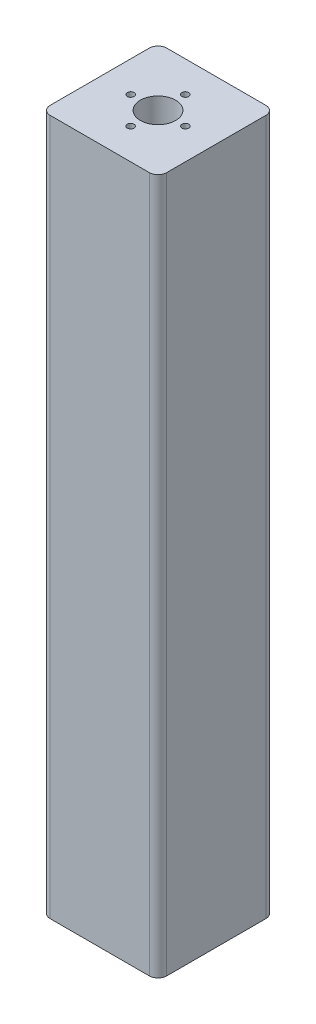
ISO-10303-21;
HEADER;
FILE_DESCRIPTION(('STEP AP214'),'2;1');
FILE_NAME('part.step','',(''),(''),'','','');
FILE_SCHEMA(('AUTOMOTIVE_DESIGN { 1 0 10303 214 1 1 1 1 }'));
ENDSEC;
DATA;
#1=APPLICATION_CONTEXT('core data for automotive mechanical design processes');
#2=APPLICATION_PROTOCOL_DEFINITION('international standard','automotive_design',2000,#1);
#3=PRODUCT_CONTEXT('',#1,'mechanical');
#4=PRODUCT('Part','Part','',(#3));
#5=PRODUCT_RELATED_PRODUCT_CATEGORY('part','',(#4));
#6=PRODUCT_DEFINITION_FORMATION('','',#4);
#7=PRODUCT_DEFINITION_CONTEXT('part definition',#1,'design');
#8=PRODUCT_DEFINITION('design','',#6,#7);
#9=PRODUCT_DEFINITION_SHAPE('','',#8);
#10=(LENGTH_UNIT() NAMED_UNIT(*) SI_UNIT(.MILLI.,.METRE.));
#11=(NAMED_UNIT(*) PLANE_ANGLE_UNIT() SI_UNIT($,.RADIAN.));
#12=(NAMED_UNIT(*) SI_UNIT($,.STERADIAN.) SOLID_ANGLE_UNIT());
#13=UNCERTAINTY_MEASURE_WITH_UNIT(LENGTH_MEASURE(1.E-05),#10,'distance_accuracy_value','');
#14=(GEOMETRIC_REPRESENTATION_CONTEXT(3) GLOBAL_UNCERTAINTY_ASSIGNED_CONTEXT((#13)) GLOBAL_UNIT_ASSIGNED_CONTEXT((#10,
#11,#12)) REPRESENTATION_CONTEXT('',''));
#15=CARTESIAN_POINT('',(0.,0.,0.));
#16=DIRECTION('',(0.,0.,1.));
#17=DIRECTION('',(1.,0.,0.));
#18=AXIS2_PLACEMENT_3D('',#15,#16,#17);
#19=CARTESIAN_POINT('',(-17.018,203.2,-17.018));
#20=DIRECTION('',(1.,0.,0.));
#21=DIRECTION('',(0.,0.,-1.));
#22=AXIS2_PLACEMENT_3D('',#19,#20,#21);
#23=PLANE('',#22);
#24=DIRECTION('',(0.,0.,1.));
#25=VECTOR('',#24,1.);
#26=CARTESIAN_POINT('',(-17.018,203.2,-17.018));
#27=LINE('',#26,#25);
#28=CARTESIAN_POINT('',(-17.018,203.2,-14.478));
#29=VERTEX_POINT('',#28);
#30=CARTESIAN_POINT('',(-17.018,203.2,14.478));
#31=VERTEX_POINT('',#30);
#32=EDGE_CURVE('E126',#29,#31,#27,.T.);
#33=ORIENTED_EDGE('',*,*,#32,.F.);
#34=DIRECTION('',(0.,-1.,0.));
#35=VECTOR('',#34,1.);
#36=CARTESIAN_POINT('',(-17.018,203.2,-14.478));
#37=LINE('',#36,#35);
#38=CARTESIAN_POINT('',(-17.018,0.,-14.478));
#39=VERTEX_POINT('',#38);
#40=EDGE_CURVE('E152',#29,#39,#37,.T.);
#41=ORIENTED_EDGE('',*,*,#40,.T.);
#42=DIRECTION('',(0.,0.,1.));
#43=VECTOR('',#42,1.);
#44=CARTESIAN_POINT('',(-17.018,0.,-17.018));
#45=LINE('',#44,#43);
#46=CARTESIAN_POINT('',(-17.018,0.,14.478));
#47=VERTEX_POINT('',#46);
#48=EDGE_CURVE('E161',#39,#47,#45,.T.);
#49=ORIENTED_EDGE('',*,*,#48,.T.);
#50=DIRECTION('',(0.,-1.,0.));
#51=VECTOR('',#50,1.);
#52=CARTESIAN_POINT('',(-17.018,203.2,14.478));
#53=LINE('',#52,#51);
#54=EDGE_CURVE('E150',#47,#31,#53,.F.);
#55=ORIENTED_EDGE('',*,*,#54,.T.);
#56=EDGE_LOOP('',(#33,#41,#49,#55));
#57=FACE_BOUND('',#56,.T.);
#58=ADVANCED_FACE('F34',(#57),#23,.F.);
#59=CARTESIAN_POINT('',(17.018,203.2,17.018));
#60=DIRECTION('',(0.,0.,-1.));
#61=DIRECTION('',(-1.,0.,0.));
#62=AXIS2_PLACEMENT_3D('',#59,#60,#61);
#63=PLANE('',#62);
#64=DIRECTION('',(1.,0.,0.));
#65=VECTOR('',#64,1.);
#66=CARTESIAN_POINT('',(17.018,0.,17.018));
#67=LINE('',#66,#65);
#68=CARTESIAN_POINT('',(-14.478,0.,17.018));
#69=VERTEX_POINT('',#68);
#70=CARTESIAN_POINT('',(14.478,0.,17.018));
#71=VERTEX_POINT('',#70);
#72=EDGE_CURVE('E131',#69,#71,#67,.T.);
#73=ORIENTED_EDGE('',*,*,#72,.T.);
#74=DIRECTION('',(0.,-1.,0.));
#75=VECTOR('',#74,1.);
#76=CARTESIAN_POINT('',(14.478,203.2,17.018));
#77=LINE('',#76,#75);
#78=CARTESIAN_POINT('',(14.478,203.2,17.018));
#79=VERTEX_POINT('',#78);
#80=EDGE_CURVE('E11',#71,#79,#77,.F.);
#81=ORIENTED_EDGE('',*,*,#80,.T.);
#82=DIRECTION('',(1.,0.,0.));
#83=VECTOR('',#82,1.);
#84=CARTESIAN_POINT('',(17.018,203.2,17.018));
#85=LINE('',#84,#83);
#86=CARTESIAN_POINT('',(-14.478,203.2,17.018));
#87=VERTEX_POINT('',#86);
#88=EDGE_CURVE('E129',#87,#79,#85,.T.);
#89=ORIENTED_EDGE('',*,*,#88,.F.);
#90=DIRECTION('',(0.,-1.,0.));
#91=VECTOR('',#90,1.);
#92=CARTESIAN_POINT('',(-14.478,203.2,17.018));
#93=LINE('',#92,#91);
#94=EDGE_CURVE('E43',#87,#69,#93,.T.);
#95=ORIENTED_EDGE('',*,*,#94,.T.);
#96=EDGE_LOOP('',(#73,#81,#89,#95));
#97=FACE_BOUND('',#96,.T.);
#98=ADVANCED_FACE('F158',(#97),#63,.F.);
#99=CARTESIAN_POINT('',(17.018,203.2,-17.018));
#100=DIRECTION('',(-1.,0.,0.));
#101=DIRECTION('',(0.,0.,1.));
#102=AXIS2_PLACEMENT_3D('',#99,#100,#101);
#103=PLANE('',#102);
#104=DIRECTION('',(0.,0.,-1.));
#105=VECTOR('',#104,1.);
#106=CARTESIAN_POINT('',(17.018,0.,-17.018));
#107=LINE('',#106,#105);
#108=CARTESIAN_POINT('',(17.018,0.,14.478));
#109=VERTEX_POINT('',#108);
#110=CARTESIAN_POINT('',(17.018,0.,-14.478));
#111=VERTEX_POINT('',#110);
#112=EDGE_CURVE('E127',#109,#111,#107,.T.);
#113=ORIENTED_EDGE('',*,*,#112,.T.);
#114=DIRECTION('',(0.,-1.,0.));
#115=VECTOR('',#114,1.);
#116=CARTESIAN_POINT('',(17.018,203.2,-14.478));
#117=LINE('',#116,#115);
#118=CARTESIAN_POINT('',(17.018,203.2,-14.478));
#119=VERTEX_POINT('',#118);
#120=EDGE_CURVE('E105',#111,#119,#117,.F.);
#121=ORIENTED_EDGE('',*,*,#120,.T.);
#122=DIRECTION('',(0.,0.,-1.));
#123=VECTOR('',#122,1.);
#124=CARTESIAN_POINT('',(17.018,203.2,-17.018));
#125=LINE('',#124,#123);
#126=CARTESIAN_POINT('',(17.018,203.2,14.478));
#127=VERTEX_POINT('',#126);
#128=EDGE_CURVE('E166',#127,#119,#125,.T.);
#129=ORIENTED_EDGE('',*,*,#128,.F.);
#130=DIRECTION('',(0.,-1.,0.));
#131=VECTOR('',#130,1.);
#132=CARTESIAN_POINT('',(17.018,203.2,14.478));
#133=LINE('',#132,#131);
#134=EDGE_CURVE('E110',#127,#109,#133,.T.);
#135=ORIENTED_EDGE('',*,*,#134,.T.);
#136=EDGE_LOOP('',(#113,#121,#129,#135));
#137=FACE_BOUND('',#136,.T.);
#138=ADVANCED_FACE('F235',(#137),#103,.F.);
#139=CARTESIAN_POINT('',(17.018,203.2,-17.018));
#140=DIRECTION('',(0.,0.,1.));
#141=DIRECTION('',(1.,0.,0.));
#142=AXIS2_PLACEMENT_3D('',#139,#140,#141);
#143=PLANE('',#142);
#144=DIRECTION('',(-1.,0.,0.));
#145=VECTOR('',#144,1.);
#146=CARTESIAN_POINT('',(17.018,203.2,-17.018));
#147=LINE('',#146,#145);
#148=CARTESIAN_POINT('',(14.478,203.2,-17.018));
#149=VERTEX_POINT('',#148);
#150=CARTESIAN_POINT('',(-14.478,203.2,-17.018));
#151=VERTEX_POINT('',#150);
#152=EDGE_CURVE('E120',#149,#151,#147,.T.);
#153=ORIENTED_EDGE('',*,*,#152,.F.);
#154=DIRECTION('',(0.,-1.,0.));
#155=VECTOR('',#154,1.);
#156=CARTESIAN_POINT('',(14.478,203.2,-17.018));
#157=LINE('',#156,#155);
#158=CARTESIAN_POINT('',(14.478,0.,-17.018));
#159=VERTEX_POINT('',#158);
#160=EDGE_CURVE('E104',#149,#159,#157,.T.);
#161=ORIENTED_EDGE('',*,*,#160,.T.);
#162=DIRECTION('',(-1.,0.,0.));
#163=VECTOR('',#162,1.);
#164=CARTESIAN_POINT('',(17.018,0.,-17.018));
#165=LINE('',#164,#163);
#166=CARTESIAN_POINT('',(-14.478,0.,-17.018));
#167=VERTEX_POINT('',#166);
#168=EDGE_CURVE('E117',#159,#167,#165,.T.);
#169=ORIENTED_EDGE('',*,*,#168,.T.);
#170=DIRECTION('',(0.,-1.,0.));
#171=VECTOR('',#170,1.);
#172=CARTESIAN_POINT('',(-14.478,203.2,-17.018));
#173=LINE('',#172,#171);
#174=EDGE_CURVE('E122',#167,#151,#173,.F.);
#175=ORIENTED_EDGE('',*,*,#174,.T.);
#176=EDGE_LOOP('',(#153,#161,#169,#175));
#177=FACE_BOUND('',#176,.T.);
#178=ADVANCED_FACE('F116',(#177),#143,.F.);
#179=CARTESIAN_POINT('',(0.,203.2,0.));
#180=DIRECTION('',(0.,-1.,0.));
#181=DIRECTION('',(0.,0.,-1.));
#182=AXIS2_PLACEMENT_3D('',#179,#180,#181);
#183=PLANE('',#182);
#184=CARTESIAN_POINT('',(0.,203.2,0.));
#185=DIRECTION('',(0.,1.,0.));
#186=DIRECTION('',(0.,0.,1.));
#187=AXIS2_PLACEMENT_3D('',#184,#185,#186);
#188=CIRCLE('',#187,5.15);
#189=CARTESIAN_POINT('',(0.,203.2,5.15));
#190=VERTEX_POINT('',#189);
#191=EDGE_CURVE('E194',#190,#190,#188,.T.);
#192=ORIENTED_EDGE('',*,*,#191,.F.);
#193=EDGE_LOOP('',(#192));
#194=FACE_BOUND('',#193,.T.);
#195=CARTESIAN_POINT('',(0.,203.2,-8.));
#196=DIRECTION('',(0.,1.,0.));
#197=DIRECTION('',(0.,0.,1.));
#198=AXIS2_PLACEMENT_3D('',#195,#196,#197);
#199=CIRCLE('',#198,1.);
#200=CARTESIAN_POINT('',(0.,203.2,-7.));
#201=VERTEX_POINT('',#200);
#202=EDGE_CURVE('E189',#201,#201,#199,.T.);
#203=ORIENTED_EDGE('',*,*,#202,.F.);
#204=EDGE_LOOP('',(#203));
#205=FACE_BOUND('',#204,.T.);
#206=CARTESIAN_POINT('',(0.,203.2,8.));
#207=DIRECTION('',(0.,1.,0.));
#208=DIRECTION('',(0.,0.,-1.));
#209=AXIS2_PLACEMENT_3D('',#206,#207,#208);
#210=CIRCLE('',#209,1.);
#211=CARTESIAN_POINT('',(0.,203.2,9.));
#212=VERTEX_POINT('',#211);
#213=EDGE_CURVE('E183',#212,#212,#210,.T.);
#214=ORIENTED_EDGE('',*,*,#213,.F.);
#215=EDGE_LOOP('',(#214));
#216=FACE_BOUND('',#215,.T.);
#217=CARTESIAN_POINT('',(-8.,203.2,0.));
#218=DIRECTION('',(0.,1.,0.));
#219=DIRECTION('',(0.,0.,1.));
#220=AXIS2_PLACEMENT_3D('',#217,#218,#219);
#221=CIRCLE('',#220,1.);
#222=CARTESIAN_POINT('',(-8.,203.2,1.));
#223=VERTEX_POINT('',#222);
#224=EDGE_CURVE('E177',#223,#223,#221,.T.);
#225=ORIENTED_EDGE('',*,*,#224,.F.);
#226=EDGE_LOOP('',(#225));
#227=FACE_BOUND('',#226,.T.);
#228=CARTESIAN_POINT('',(8.,203.2,0.));
#229=DIRECTION('',(0.,1.,0.));
#230=DIRECTION('',(0.,0.,1.));
#231=AXIS2_PLACEMENT_3D('',#228,#229,#230);
#232=CIRCLE('',#231,1.);
#233=CARTESIAN_POINT('',(8.,203.2,1.));
#234=VERTEX_POINT('',#233);
#235=EDGE_CURVE('E170',#234,#234,#232,.T.);
#236=ORIENTED_EDGE('',*,*,#235,.F.);
#237=EDGE_LOOP('',(#236));
#238=FACE_BOUND('',#237,.T.);
#239=ORIENTED_EDGE('',*,*,#128,.T.);
#240=CARTESIAN_POINT('',(14.478,203.2,-14.478));
#241=DIRECTION('',(0.,-1.,0.));
#242=DIRECTION('',(0.,0.,-1.));
#243=AXIS2_PLACEMENT_3D('',#240,#241,#242);
#244=CIRCLE('',#243,2.54);
#245=EDGE_CURVE('E148',#119,#149,#244,.F.);
#246=ORIENTED_EDGE('',*,*,#245,.T.);
#247=ORIENTED_EDGE('',*,*,#152,.T.);
#248=CARTESIAN_POINT('',(-14.478,203.2,-14.478));
#249=DIRECTION('',(0.,-1.,0.));
#250=DIRECTION('',(0.,0.,-1.));
#251=AXIS2_PLACEMENT_3D('',#248,#249,#250);
#252=CIRCLE('',#251,2.54);
#253=EDGE_CURVE('E146',#151,#29,#252,.F.);
#254=ORIENTED_EDGE('',*,*,#253,.T.);
#255=ORIENTED_EDGE('',*,*,#32,.T.);
#256=CARTESIAN_POINT('',(-14.478,203.2,14.478));
#257=DIRECTION('',(0.,-1.,0.));
#258=DIRECTION('',(0.,0.,-1.));
#259=AXIS2_PLACEMENT_3D('',#256,#257,#258);
#260=CIRCLE('',#259,2.54);
#261=EDGE_CURVE('E55',#31,#87,#260,.F.);
#262=ORIENTED_EDGE('',*,*,#261,.T.);
#263=ORIENTED_EDGE('',*,*,#88,.T.);
#264=CARTESIAN_POINT('',(14.478,203.2,14.478));
#265=DIRECTION('',(0.,-1.,0.));
#266=DIRECTION('',(0.,0.,-1.));
#267=AXIS2_PLACEMENT_3D('',#264,#265,#266);
#268=CIRCLE('',#267,2.54);
#269=EDGE_CURVE('E144',#79,#127,#268,.F.);
#270=ORIENTED_EDGE('',*,*,#269,.T.);
#271=EDGE_LOOP('',(#239,#246,#247,#254,#255,#262,#263,#270));
#272=FACE_BOUND('',#271,.T.);
#273=ADVANCED_FACE('F220',(#194,#205,#216,#227,#238,#272),#183,.F.);
#274=CARTESIAN_POINT('',(0.,0.,0.));
#275=DIRECTION('',(0.,-1.,0.));
#276=DIRECTION('',(0.,0.,-1.));
#277=AXIS2_PLACEMENT_3D('',#274,#275,#276);
#278=PLANE('',#277);
#279=CARTESIAN_POINT('',(0.,0.,0.));
#280=DIRECTION('',(0.,-1.,0.));
#281=DIRECTION('',(0.,0.,-1.));
#282=AXIS2_PLACEMENT_3D('',#279,#280,#281);
#283=CIRCLE('',#282,1.5875);
#284=CARTESIAN_POINT('',(0.,0.,-1.5875));
#285=VERTEX_POINT('',#284);
#286=EDGE_CURVE('E199',#285,#285,#283,.T.);
#287=ORIENTED_EDGE('',*,*,#286,.F.);
#288=EDGE_LOOP('',(#287));
#289=FACE_BOUND('',#288,.T.);
#290=ORIENTED_EDGE('',*,*,#168,.F.);
#291=CARTESIAN_POINT('',(14.478,0.,-14.478));
#292=DIRECTION('',(0.,-1.,0.));
#293=DIRECTION('',(0.,0.,-1.));
#294=AXIS2_PLACEMENT_3D('',#291,#292,#293);
#295=CIRCLE('',#294,2.54);
#296=EDGE_CURVE('E100',#159,#111,#295,.T.);
#297=ORIENTED_EDGE('',*,*,#296,.T.);
#298=ORIENTED_EDGE('',*,*,#112,.F.);
#299=CARTESIAN_POINT('',(14.478,0.,14.478));
#300=DIRECTION('',(0.,-1.,0.));
#301=DIRECTION('',(0.,0.,-1.));
#302=AXIS2_PLACEMENT_3D('',#299,#300,#301);
#303=CIRCLE('',#302,2.54);
#304=EDGE_CURVE('E137',#109,#71,#303,.T.);
#305=ORIENTED_EDGE('',*,*,#304,.T.);
#306=ORIENTED_EDGE('',*,*,#72,.F.);
#307=CARTESIAN_POINT('',(-14.478,0.,14.478));
#308=DIRECTION('',(0.,-1.,0.));
#309=DIRECTION('',(0.,0.,-1.));
#310=AXIS2_PLACEMENT_3D('',#307,#308,#309);
#311=CIRCLE('',#310,2.54);
#312=EDGE_CURVE('E121',#69,#47,#311,.T.);
#313=ORIENTED_EDGE('',*,*,#312,.T.);
#314=ORIENTED_EDGE('',*,*,#48,.F.);
#315=CARTESIAN_POINT('',(-14.478,0.,-14.478));
#316=DIRECTION('',(0.,-1.,0.));
#317=DIRECTION('',(0.,0.,-1.));
#318=AXIS2_PLACEMENT_3D('',#315,#316,#317);
#319=CIRCLE('',#318,2.54);
#320=EDGE_CURVE('E111',#39,#167,#319,.T.);
#321=ORIENTED_EDGE('',*,*,#320,.T.);
#322=EDGE_LOOP('',(#290,#297,#298,#305,#306,#313,#314,#321));
#323=FACE_BOUND('',#322,.T.);
#324=ADVANCED_FACE('F124',(#289,#323),#278,.T.);
#325=CARTESIAN_POINT('',(8.,165.1,0.));
#326=DIRECTION('',(0.,1.,0.));
#327=DIRECTION('',(0.,0.,1.));
#328=AXIS2_PLACEMENT_3D('',#325,#326,#327);
#329=CYLINDRICAL_SURFACE('',#328,1.);
#330=CARTESIAN_POINT('',(8.,165.1,0.));
#331=DIRECTION('',(0.,1.,0.));
#332=DIRECTION('',(0.,0.,1.));
#333=AXIS2_PLACEMENT_3D('',#330,#331,#332);
#334=CIRCLE('',#333,1.);
#335=CARTESIAN_POINT('',(8.,165.1,1.));
#336=VERTEX_POINT('',#335);
#337=EDGE_CURVE('E173',#336,#336,#334,.T.);
#338=CARTESIAN_POINT('',(8.,165.1,1.));
#339=CARTESIAN_POINT('',(8.,165.496875,1.));
#340=CARTESIAN_POINT('',(8.,165.89375,1.));
#341=CARTESIAN_POINT('',(8.,166.6875,1.));
#342=CARTESIAN_POINT('',(8.,167.084375,1.));
#343=CARTESIAN_POINT('',(8.,167.878125,1.));
#344=CARTESIAN_POINT('',(8.,168.275,1.));
#345=CARTESIAN_POINT('',(8.,169.06875,1.));
#346=CARTESIAN_POINT('',(8.,169.465625,1.));
#347=CARTESIAN_POINT('',(8.,170.259375,1.));
#348=CARTESIAN_POINT('',(8.,170.65625,1.));
#349=CARTESIAN_POINT('',(8.,171.45,1.));
#350=CARTESIAN_POINT('',(8.,171.846875,1.));
#351=CARTESIAN_POINT('',(8.,172.640625,1.));
#352=CARTESIAN_POINT('',(8.,173.0375,1.));
#353=CARTESIAN_POINT('',(8.,173.83125,1.));
#354=CARTESIAN_POINT('',(8.,174.228125,1.));
#355=CARTESIAN_POINT('',(8.,175.021875,1.));
#356=CARTESIAN_POINT('',(8.,175.41875,1.));
#357=CARTESIAN_POINT('',(8.,176.2125,1.));
#358=CARTESIAN_POINT('',(8.,176.609375,1.));
#359=CARTESIAN_POINT('',(8.,177.403125,1.));
#360=CARTESIAN_POINT('',(8.,177.8,1.));
#361=CARTESIAN_POINT('',(8.,178.59375,1.));
#362=CARTESIAN_POINT('',(8.,178.990625,1.));
#363=CARTESIAN_POINT('',(8.,179.784375,1.));
#364=CARTESIAN_POINT('',(8.,180.18125,1.));
#365=CARTESIAN_POINT('',(8.,180.975,1.));
#366=CARTESIAN_POINT('',(8.,181.371875,1.));
#367=CARTESIAN_POINT('',(8.,182.165625,1.));
#368=CARTESIAN_POINT('',(8.,182.5625,1.));
#369=CARTESIAN_POINT('',(8.,183.35625,1.));
#370=CARTESIAN_POINT('',(8.,183.753125,1.));
#371=CARTESIAN_POINT('',(8.,184.546875,1.));
#372=CARTESIAN_POINT('',(8.,184.94375,1.));
#373=CARTESIAN_POINT('',(8.,185.7375,1.));
#374=CARTESIAN_POINT('',(8.,186.134375,1.));
#375=CARTESIAN_POINT('',(8.,186.928125,1.));
#376=CARTESIAN_POINT('',(8.,187.325,1.));
#377=CARTESIAN_POINT('',(8.,188.11875,1.));
#378=CARTESIAN_POINT('',(8.,188.515625,1.));
#379=CARTESIAN_POINT('',(8.,189.309375,1.));
#380=CARTESIAN_POINT('',(8.,189.70625,1.));
#381=CARTESIAN_POINT('',(8.,190.5,1.));
#382=CARTESIAN_POINT('',(8.,190.896875,1.));
#383=CARTESIAN_POINT('',(8.,191.690625,1.));
#384=CARTESIAN_POINT('',(8.,192.0875,1.));
#385=CARTESIAN_POINT('',(8.,192.88125,1.));
#386=CARTESIAN_POINT('',(8.,193.278125,1.));
#387=CARTESIAN_POINT('',(8.,194.071875,1.));
#388=CARTESIAN_POINT('',(8.,194.46875,1.));
#389=CARTESIAN_POINT('',(8.,195.2625,1.));
#390=CARTESIAN_POINT('',(8.,195.659375,1.));
#391=CARTESIAN_POINT('',(8.,196.453125,1.));
#392=CARTESIAN_POINT('',(8.,196.85,1.));
#393=CARTESIAN_POINT('',(8.,197.64375,1.));
#394=CARTESIAN_POINT('',(8.,198.040625,1.));
#395=CARTESIAN_POINT('',(8.,198.834375,1.));
#396=CARTESIAN_POINT('',(8.,199.23125,1.));
#397=CARTESIAN_POINT('',(8.,200.025,1.));
#398=CARTESIAN_POINT('',(8.,200.421875,1.));
#399=CARTESIAN_POINT('',(8.,201.215625,1.));
#400=CARTESIAN_POINT('',(8.,201.6125,1.));
#401=CARTESIAN_POINT('',(8.,202.40625,1.));
#402=CARTESIAN_POINT('',(8.,202.803125,1.));
#403=CARTESIAN_POINT('',(8.,203.2,1.));
#404=B_SPLINE_CURVE_WITH_KNOTS('',3,(#338,#339,#340,#341,#342,#343,#344,#345,#346,#347,#348,
#349,#350,#351,#352,#353,#354,#355,#356,#357,#358,#359,#360,#361,#362,#363,#364,#365,#366,#367,
#368,#369,#370,#371,#372,#373,#374,#375,#376,#377,#378,#379,#380,#381,#382,#383,#384,#385,#386,
#387,#388,#389,#390,#391,#392,#393,#394,#395,#396,#397,#398,#399,#400,#401,#402,#403),
.UNSPECIFIED.,.F.,.F.,(4,2,2,2,2,2,2,2,2,2,2,2,2,2,2,2,2,2,2,2,2,2,2,2,2,2,2,2,2,2,2,2,4),(0.,
1.19062499999997,2.38124999999997,3.57187499999997,4.76249999999998,5.95312499999998,
7.14374999999998,8.33437499999998,9.52499999999998,10.715625,11.90625,13.096875,14.2875,
15.478125,16.66875,17.859375,19.05,20.240625,21.43125,22.621875,23.8125,25.003125,26.19375,
27.384375,28.575,29.765625,30.95625,32.146875,33.3375,34.528125,35.71875,36.909375,38.1),.UNSPECIFIED.);
#405=EDGE_CURVE('BSEAM289',#336,#234,#404,.T.);
#406=ORIENTED_EDGE('',*,*,#337,.F.);
#407=ORIENTED_EDGE('',*,*,#235,.T.);
#408=ORIENTED_EDGE('',*,*,#405,.T.);
#409=ORIENTED_EDGE('',*,*,#405,.F.);
#410=EDGE_LOOP('',(#406,#408,#407,#409));
#411=FACE_BOUND('',#410,.T.);
#412=ADVANCED_FACE('F289',(#411),#329,.F.);
#413=CARTESIAN_POINT('',(8.,165.1,0.));
#414=DIRECTION('',(0.,1.,0.));
#415=DIRECTION('',(0.,0.,1.));
#416=AXIS2_PLACEMENT_3D('',#413,#414,#415);
#417=PLANE('',#416);
#418=ORIENTED_EDGE('',*,*,#337,.T.);
#419=EDGE_LOOP('',(#418));
#420=FACE_BOUND('',#419,.T.);
#421=ADVANCED_FACE('F285',(#420),#417,.T.);
#422=CARTESIAN_POINT('',(-8.,165.1,0.));
#423=DIRECTION('',(0.,1.,0.));
#424=DIRECTION('',(0.,0.,1.));
#425=AXIS2_PLACEMENT_3D('',#422,#423,#424);
#426=CYLINDRICAL_SURFACE('',#425,1.);
#427=CARTESIAN_POINT('',(-8.,165.1,0.));
#428=DIRECTION('',(0.,1.,0.));
#429=DIRECTION('',(0.,0.,1.));
#430=AXIS2_PLACEMENT_3D('',#427,#428,#429);
#431=CIRCLE('',#430,1.);
#432=CARTESIAN_POINT('',(-8.,165.1,1.));
#433=VERTEX_POINT('',#432);
#434=EDGE_CURVE('E180',#433,#433,#431,.T.);
#435=CARTESIAN_POINT('',(-8.,165.1,1.));
#436=CARTESIAN_POINT('',(-8.,165.496875,1.));
#437=CARTESIAN_POINT('',(-8.,165.89375,1.));
#438=CARTESIAN_POINT('',(-8.,166.6875,1.));
#439=CARTESIAN_POINT('',(-8.,167.084375,1.));
#440=CARTESIAN_POINT('',(-8.,167.878125,1.));
#441=CARTESIAN_POINT('',(-8.,168.275,1.));
#442=CARTESIAN_POINT('',(-8.,169.06875,1.));
#443=CARTESIAN_POINT('',(-8.,169.465625,1.));
#444=CARTESIAN_POINT('',(-8.,170.259375,1.));
#445=CARTESIAN_POINT('',(-8.,170.65625,1.));
#446=CARTESIAN_POINT('',(-8.,171.45,1.));
#447=CARTESIAN_POINT('',(-8.,171.846875,1.));
#448=CARTESIAN_POINT('',(-8.,172.640625,1.));
#449=CARTESIAN_POINT('',(-8.,173.0375,1.));
#450=CARTESIAN_POINT('',(-8.,173.83125,1.));
#451=CARTESIAN_POINT('',(-8.,174.228125,1.));
#452=CARTESIAN_POINT('',(-8.,175.021875,1.));
#453=CARTESIAN_POINT('',(-8.,175.41875,1.));
#454=CARTESIAN_POINT('',(-8.,176.2125,1.));
#455=CARTESIAN_POINT('',(-8.,176.609375,1.));
#456=CARTESIAN_POINT('',(-8.,177.403125,1.));
#457=CARTESIAN_POINT('',(-8.,177.8,1.));
#458=CARTESIAN_POINT('',(-8.,178.59375,1.));
#459=CARTESIAN_POINT('',(-8.,178.990625,1.));
#460=CARTESIAN_POINT('',(-8.,179.784375,1.));
#461=CARTESIAN_POINT('',(-8.,180.18125,1.));
#462=CARTESIAN_POINT('',(-8.,180.975,1.));
#463=CARTESIAN_POINT('',(-8.,181.371875,1.));
#464=CARTESIAN_POINT('',(-8.,182.165625,1.));
#465=CARTESIAN_POINT('',(-8.,182.5625,1.));
#466=CARTESIAN_POINT('',(-8.,183.35625,1.));
#467=CARTESIAN_POINT('',(-8.,183.753125,1.));
#468=CARTESIAN_POINT('',(-8.,184.546875,1.));
#469=CARTESIAN_POINT('',(-8.,184.94375,1.));
#470=CARTESIAN_POINT('',(-8.,185.7375,1.));
#471=CARTESIAN_POINT('',(-8.,186.134375,1.));
#472=CARTESIAN_POINT('',(-8.,186.928125,1.));
#473=CARTESIAN_POINT('',(-8.,187.325,1.));
#474=CARTESIAN_POINT('',(-8.,188.11875,1.));
#475=CARTESIAN_POINT('',(-8.,188.515625,1.));
#476=CARTESIAN_POINT('',(-8.,189.309375,1.));
#477=CARTESIAN_POINT('',(-8.,189.70625,1.));
#478=CARTESIAN_POINT('',(-8.,190.5,1.));
#479=CARTESIAN_POINT('',(-8.,190.896875,1.));
#480=CARTESIAN_POINT('',(-8.,191.690625,1.));
#481=CARTESIAN_POINT('',(-8.,192.0875,1.));
#482=CARTESIAN_POINT('',(-8.,192.88125,1.));
#483=CARTESIAN_POINT('',(-8.,193.278125,1.));
#484=CARTESIAN_POINT('',(-8.,194.071875,1.));
#485=CARTESIAN_POINT('',(-8.,194.46875,1.));
#486=CARTESIAN_POINT('',(-8.,195.2625,1.));
#487=CARTESIAN_POINT('',(-8.,195.659375,1.));
#488=CARTESIAN_POINT('',(-8.,196.453125,1.));
#489=CARTESIAN_POINT('',(-8.,196.85,1.));
#490=CARTESIAN_POINT('',(-8.,197.64375,1.));
#491=CARTESIAN_POINT('',(-8.,198.040625,1.));
#492=CARTESIAN_POINT('',(-8.,198.834375,1.));
#493=CARTESIAN_POINT('',(-8.,199.23125,1.));
#494=CARTESIAN_POINT('',(-8.,200.025,1.));
#495=CARTESIAN_POINT('',(-8.,200.421875,1.));
#496=CARTESIAN_POINT('',(-8.,201.215625,1.));
#497=CARTESIAN_POINT('',(-8.,201.6125,1.));
#498=CARTESIAN_POINT('',(-8.,202.40625,1.));
#499=CARTESIAN_POINT('',(-8.,202.803125,1.));
#500=CARTESIAN_POINT('',(-8.,203.2,1.));
#501=B_SPLINE_CURVE_WITH_KNOTS('',3,(#435,#436,#437,#438,#439,#440,#441,#442,#443,#444,#445,
#446,#447,#448,#449,#450,#451,#452,#453,#454,#455,#456,#457,#458,#459,#460,#461,#462,#463,#464,
#465,#466,#467,#468,#469,#470,#471,#472,#473,#474,#475,#476,#477,#478,#479,#480,#481,#482,#483,
#484,#485,#486,#487,#488,#489,#490,#491,#492,#493,#494,#495,#496,#497,#498,#499,#500),
.UNSPECIFIED.,.F.,.F.,(4,2,2,2,2,2,2,2,2,2,2,2,2,2,2,2,2,2,2,2,2,2,2,2,2,2,2,2,2,2,2,2,4),(0.,
1.19062499999997,2.38124999999997,3.57187499999997,4.76249999999998,5.95312499999998,
7.14374999999998,8.33437499999998,9.52499999999998,10.715625,11.90625,13.096875,14.2875,
15.478125,16.66875,17.859375,19.05,20.240625,21.43125,22.621875,23.8125,25.003125,26.19375,
27.384375,28.575,29.765625,30.95625,32.146875,33.3375,34.528125,35.71875,36.909375,38.1),.UNSPECIFIED.);
#502=EDGE_CURVE('BSEAM281',#433,#223,#501,.T.);
#503=ORIENTED_EDGE('',*,*,#434,.F.);
#504=ORIENTED_EDGE('',*,*,#224,.T.);
#505=ORIENTED_EDGE('',*,*,#502,.T.);
#506=ORIENTED_EDGE('',*,*,#502,.F.);
#507=EDGE_LOOP('',(#503,#505,#504,#506));
#508=FACE_BOUND('',#507,.T.);
#509=ADVANCED_FACE('F281',(#508),#426,.F.);
#510=CARTESIAN_POINT('',(-8.,165.1,0.));
#511=DIRECTION('',(0.,1.,0.));
#512=DIRECTION('',(0.,0.,1.));
#513=AXIS2_PLACEMENT_3D('',#510,#511,#512);
#514=PLANE('',#513);
#515=ORIENTED_EDGE('',*,*,#434,.T.);
#516=EDGE_LOOP('',(#515));
#517=FACE_BOUND('',#516,.T.);
#518=ADVANCED_FACE('F277',(#517),#514,.T.);
#519=CARTESIAN_POINT('',(0.,165.1,8.));
#520=DIRECTION('',(0.,1.,0.));
#521=DIRECTION('',(0.,0.,1.));
#522=AXIS2_PLACEMENT_3D('',#519,#520,#521);
#523=CYLINDRICAL_SURFACE('',#522,1.);
#524=CARTESIAN_POINT('',(0.,165.1,8.));
#525=DIRECTION('',(0.,1.,0.));
#526=DIRECTION('',(0.,0.,-1.));
#527=AXIS2_PLACEMENT_3D('',#524,#525,#526);
#528=CIRCLE('',#527,1.);
#529=CARTESIAN_POINT('',(0.,165.1,9.));
#530=VERTEX_POINT('',#529);
#531=EDGE_CURVE('E186',#530,#530,#528,.T.);
#532=CARTESIAN_POINT('',(0.,165.1,9.));
#533=CARTESIAN_POINT('',(0.,165.496875,9.));
#534=CARTESIAN_POINT('',(0.,165.89375,9.));
#535=CARTESIAN_POINT('',(0.,166.6875,9.));
#536=CARTESIAN_POINT('',(0.,167.084375,9.));
#537=CARTESIAN_POINT('',(0.,167.878125,9.));
#538=CARTESIAN_POINT('',(0.,168.275,9.));
#539=CARTESIAN_POINT('',(0.,169.06875,9.));
#540=CARTESIAN_POINT('',(0.,169.465625,9.));
#541=CARTESIAN_POINT('',(0.,170.259375,9.));
#542=CARTESIAN_POINT('',(0.,170.65625,9.));
#543=CARTESIAN_POINT('',(0.,171.45,9.));
#544=CARTESIAN_POINT('',(0.,171.846875,9.));
#545=CARTESIAN_POINT('',(0.,172.640625,9.));
#546=CARTESIAN_POINT('',(0.,173.0375,9.));
#547=CARTESIAN_POINT('',(0.,173.83125,9.));
#548=CARTESIAN_POINT('',(0.,174.228125,9.));
#549=CARTESIAN_POINT('',(0.,175.021875,9.));
#550=CARTESIAN_POINT('',(0.,175.41875,9.));
#551=CARTESIAN_POINT('',(0.,176.2125,9.));
#552=CARTESIAN_POINT('',(0.,176.609375,9.));
#553=CARTESIAN_POINT('',(0.,177.403125,9.));
#554=CARTESIAN_POINT('',(0.,177.8,9.));
#555=CARTESIAN_POINT('',(0.,178.59375,9.));
#556=CARTESIAN_POINT('',(0.,178.990625,9.));
#557=CARTESIAN_POINT('',(0.,179.784375,9.));
#558=CARTESIAN_POINT('',(0.,180.18125,9.));
#559=CARTESIAN_POINT('',(0.,180.975,9.));
#560=CARTESIAN_POINT('',(0.,181.371875,9.));
#561=CARTESIAN_POINT('',(0.,182.165625,9.));
#562=CARTESIAN_POINT('',(0.,182.5625,9.));
#563=CARTESIAN_POINT('',(0.,183.35625,9.));
#564=CARTESIAN_POINT('',(0.,183.753125,9.));
#565=CARTESIAN_POINT('',(0.,184.546875,9.));
#566=CARTESIAN_POINT('',(0.,184.94375,9.));
#567=CARTESIAN_POINT('',(0.,185.7375,9.));
#568=CARTESIAN_POINT('',(0.,186.134375,9.));
#569=CARTESIAN_POINT('',(0.,186.928125,9.));
#570=CARTESIAN_POINT('',(0.,187.325,9.));
#571=CARTESIAN_POINT('',(0.,188.11875,9.));
#572=CARTESIAN_POINT('',(0.,188.515625,9.));
#573=CARTESIAN_POINT('',(0.,189.309375,9.));
#574=CARTESIAN_POINT('',(0.,189.70625,9.));
#575=CARTESIAN_POINT('',(0.,190.5,9.));
#576=CARTESIAN_POINT('',(0.,190.896875,9.));
#577=CARTESIAN_POINT('',(0.,191.690625,9.));
#578=CARTESIAN_POINT('',(0.,192.0875,9.));
#579=CARTESIAN_POINT('',(0.,192.88125,9.));
#580=CARTESIAN_POINT('',(0.,193.278125,9.));
#581=CARTESIAN_POINT('',(0.,194.071875,9.));
#582=CARTESIAN_POINT('',(0.,194.46875,9.));
#583=CARTESIAN_POINT('',(0.,195.2625,9.));
#584=CARTESIAN_POINT('',(0.,195.659375,9.));
#585=CARTESIAN_POINT('',(0.,196.453125,9.));
#586=CARTESIAN_POINT('',(0.,196.85,9.));
#587=CARTESIAN_POINT('',(0.,197.64375,9.));
#588=CARTESIAN_POINT('',(0.,198.040625,9.));
#589=CARTESIAN_POINT('',(0.,198.834375,9.));
#590=CARTESIAN_POINT('',(0.,199.23125,9.));
#591=CARTESIAN_POINT('',(0.,200.025,9.));
#592=CARTESIAN_POINT('',(0.,200.421875,9.));
#593=CARTESIAN_POINT('',(0.,201.215625,9.));
#594=CARTESIAN_POINT('',(0.,201.6125,9.));
#595=CARTESIAN_POINT('',(0.,202.40625,9.));
#596=CARTESIAN_POINT('',(0.,202.803125,9.));
#597=CARTESIAN_POINT('',(0.,203.2,9.));
#598=B_SPLINE_CURVE_WITH_KNOTS('',3,(#532,#533,#534,#535,#536,#537,#538,#539,#540,#541,#542,
#543,#544,#545,#546,#547,#548,#549,#550,#551,#552,#553,#554,#555,#556,#557,#558,#559,#560,#561,
#562,#563,#564,#565,#566,#567,#568,#569,#570,#571,#572,#573,#574,#575,#576,#577,#578,#579,#580,
#581,#582,#583,#584,#585,#586,#587,#588,#589,#590,#591,#592,#593,#594,#595,#596,#597),
.UNSPECIFIED.,.F.,.F.,(4,2,2,2,2,2,2,2,2,2,2,2,2,2,2,2,2,2,2,2,2,2,2,2,2,2,2,2,2,2,2,2,4),(0.,
1.19062499999997,2.38124999999997,3.57187499999997,4.76249999999998,5.95312499999998,
7.14374999999998,8.33437499999998,9.52499999999998,10.715625,11.90625,13.096875,14.2875,
15.478125,16.66875,17.859375,19.05,20.240625,21.43125,22.621875,23.8125,25.003125,26.19375,
27.384375,28.575,29.765625,30.95625,32.146875,33.3375,34.528125,35.71875,36.909375,38.1),.UNSPECIFIED.);
#599=EDGE_CURVE('BSEAM273',#530,#212,#598,.T.);
#600=ORIENTED_EDGE('',*,*,#531,.F.);
#601=ORIENTED_EDGE('',*,*,#213,.T.);
#602=ORIENTED_EDGE('',*,*,#599,.T.);
#603=ORIENTED_EDGE('',*,*,#599,.F.);
#604=EDGE_LOOP('',(#600,#602,#601,#603));
#605=FACE_BOUND('',#604,.T.);
#606=ADVANCED_FACE('F273',(#605),#523,.F.);
#607=CARTESIAN_POINT('',(0.,165.1,8.));
#608=DIRECTION('',(0.,-1.,0.));
#609=DIRECTION('',(0.,0.,-1.));
#610=AXIS2_PLACEMENT_3D('',#607,#608,#609);
#611=PLANE('',#610);
#612=ORIENTED_EDGE('',*,*,#531,.T.);
#613=EDGE_LOOP('',(#612));
#614=FACE_BOUND('',#613,.T.);
#615=ADVANCED_FACE('F267',(#614),#611,.F.);
#616=CARTESIAN_POINT('',(0.,165.1,-8.));
#617=DIRECTION('',(0.,1.,0.));
#618=DIRECTION('',(0.,0.,1.));
#619=AXIS2_PLACEMENT_3D('',#616,#617,#618);
#620=CYLINDRICAL_SURFACE('',#619,1.);
#621=CARTESIAN_POINT('',(0.,165.1,-8.));
#622=DIRECTION('',(0.,1.,0.));
#623=DIRECTION('',(0.,0.,1.));
#624=AXIS2_PLACEMENT_3D('',#621,#622,#623);
#625=CIRCLE('',#624,1.);
#626=CARTESIAN_POINT('',(0.,165.1,-7.));
#627=VERTEX_POINT('',#626);
#628=EDGE_CURVE('E162',#627,#627,#625,.T.);
#629=CARTESIAN_POINT('',(0.,165.1,-7.));
#630=CARTESIAN_POINT('',(0.,165.496875,-7.));
#631=CARTESIAN_POINT('',(0.,165.89375,-7.));
#632=CARTESIAN_POINT('',(0.,166.6875,-7.));
#633=CARTESIAN_POINT('',(0.,167.084375,-7.));
#634=CARTESIAN_POINT('',(0.,167.878125,-7.));
#635=CARTESIAN_POINT('',(0.,168.275,-7.));
#636=CARTESIAN_POINT('',(0.,169.06875,-7.));
#637=CARTESIAN_POINT('',(0.,169.465625,-7.));
#638=CARTESIAN_POINT('',(0.,170.259375,-7.));
#639=CARTESIAN_POINT('',(0.,170.65625,-7.));
#640=CARTESIAN_POINT('',(0.,171.45,-7.));
#641=CARTESIAN_POINT('',(0.,171.846875,-7.));
#642=CARTESIAN_POINT('',(0.,172.640625,-7.));
#643=CARTESIAN_POINT('',(0.,173.0375,-7.));
#644=CARTESIAN_POINT('',(0.,173.83125,-7.));
#645=CARTESIAN_POINT('',(0.,174.228125,-7.));
#646=CARTESIAN_POINT('',(0.,175.021875,-7.));
#647=CARTESIAN_POINT('',(0.,175.41875,-7.));
#648=CARTESIAN_POINT('',(0.,176.2125,-7.));
#649=CARTESIAN_POINT('',(0.,176.609375,-7.));
#650=CARTESIAN_POINT('',(0.,177.403125,-7.));
#651=CARTESIAN_POINT('',(0.,177.8,-7.));
#652=CARTESIAN_POINT('',(0.,178.59375,-7.));
#653=CARTESIAN_POINT('',(0.,178.990625,-7.));
#654=CARTESIAN_POINT('',(0.,179.784375,-7.));
#655=CARTESIAN_POINT('',(0.,180.18125,-7.));
#656=CARTESIAN_POINT('',(0.,180.975,-7.));
#657=CARTESIAN_POINT('',(0.,181.371875,-7.));
#658=CARTESIAN_POINT('',(0.,182.165625,-7.));
#659=CARTESIAN_POINT('',(0.,182.5625,-7.));
#660=CARTESIAN_POINT('',(0.,183.35625,-7.));
#661=CARTESIAN_POINT('',(0.,183.753125,-7.));
#662=CARTESIAN_POINT('',(0.,184.546875,-7.));
#663=CARTESIAN_POINT('',(0.,184.94375,-7.));
#664=CARTESIAN_POINT('',(0.,185.7375,-7.));
#665=CARTESIAN_POINT('',(0.,186.134375,-7.));
#666=CARTESIAN_POINT('',(0.,186.928125,-7.));
#667=CARTESIAN_POINT('',(0.,187.325,-7.));
#668=CARTESIAN_POINT('',(0.,188.11875,-7.));
#669=CARTESIAN_POINT('',(0.,188.515625,-7.));
#670=CARTESIAN_POINT('',(0.,189.309375,-7.));
#671=CARTESIAN_POINT('',(0.,189.70625,-7.));
#672=CARTESIAN_POINT('',(0.,190.5,-7.));
#673=CARTESIAN_POINT('',(0.,190.896875,-7.));
#674=CARTESIAN_POINT('',(0.,191.690625,-7.));
#675=CARTESIAN_POINT('',(0.,192.0875,-7.));
#676=CARTESIAN_POINT('',(0.,192.88125,-7.));
#677=CARTESIAN_POINT('',(0.,193.278125,-7.));
#678=CARTESIAN_POINT('',(0.,194.071875,-7.));
#679=CARTESIAN_POINT('',(0.,194.46875,-7.));
#680=CARTESIAN_POINT('',(0.,195.2625,-7.));
#681=CARTESIAN_POINT('',(0.,195.659375,-7.));
#682=CARTESIAN_POINT('',(0.,196.453125,-7.));
#683=CARTESIAN_POINT('',(0.,196.85,-7.));
#684=CARTESIAN_POINT('',(0.,197.64375,-7.));
#685=CARTESIAN_POINT('',(0.,198.040625,-7.));
#686=CARTESIAN_POINT('',(0.,198.834375,-7.));
#687=CARTESIAN_POINT('',(0.,199.23125,-7.));
#688=CARTESIAN_POINT('',(0.,200.025,-7.));
#689=CARTESIAN_POINT('',(0.,200.421875,-7.));
#690=CARTESIAN_POINT('',(0.,201.215625,-7.));
#691=CARTESIAN_POINT('',(0.,201.6125,-7.));
#692=CARTESIAN_POINT('',(0.,202.40625,-7.));
#693=CARTESIAN_POINT('',(0.,202.803125,-7.));
#694=CARTESIAN_POINT('',(0.,203.2,-7.));
#695=B_SPLINE_CURVE_WITH_KNOTS('',3,(#629,#630,#631,#632,#633,#634,#635,#636,#637,#638,#639,
#640,#641,#642,#643,#644,#645,#646,#647,#648,#649,#650,#651,#652,#653,#654,#655,#656,#657,#658,
#659,#660,#661,#662,#663,#664,#665,#666,#667,#668,#669,#670,#671,#672,#673,#674,#675,#676,#677,
#678,#679,#680,#681,#682,#683,#684,#685,#686,#687,#688,#689,#690,#691,#692,#693,#694),
.UNSPECIFIED.,.F.,.F.,(4,2,2,2,2,2,2,2,2,2,2,2,2,2,2,2,2,2,2,2,2,2,2,2,2,2,2,2,2,2,2,2,4),(0.,
1.19062499999997,2.38124999999997,3.57187499999997,4.76249999999998,5.95312499999998,
7.14374999999998,8.33437499999998,9.52499999999998,10.715625,11.90625,13.096875,14.2875,
15.478125,16.66875,17.859375,19.05,20.240625,21.43125,22.621875,23.8125,25.003125,26.19375,
27.384375,28.575,29.765625,30.95625,32.146875,33.3375,34.528125,35.71875,36.909375,38.1),.UNSPECIFIED.);
#696=EDGE_CURVE('BSEAM261',#627,#201,#695,.T.);
#697=ORIENTED_EDGE('',*,*,#628,.F.);
#698=ORIENTED_EDGE('',*,*,#202,.T.);
#699=ORIENTED_EDGE('',*,*,#696,.T.);
#700=ORIENTED_EDGE('',*,*,#696,.F.);
#701=EDGE_LOOP('',(#697,#699,#698,#700));
#702=FACE_BOUND('',#701,.T.);
#703=ADVANCED_FACE('F261',(#702),#620,.F.);
#704=CARTESIAN_POINT('',(0.,165.1,-8.));
#705=DIRECTION('',(0.,1.,0.));
#706=DIRECTION('',(0.,0.,1.));
#707=AXIS2_PLACEMENT_3D('',#704,#705,#706);
#708=PLANE('',#707);
#709=ORIENTED_EDGE('',*,*,#628,.T.);
#710=EDGE_LOOP('',(#709));
#711=FACE_BOUND('',#710,.T.);
#712=ADVANCED_FACE('F257',(#711),#708,.T.);
#713=CARTESIAN_POINT('',(14.478,203.2,-14.478));
#714=DIRECTION('',(0.,-1.,0.));
#715=DIRECTION('',(0.,0.,-1.));
#716=AXIS2_PLACEMENT_3D('',#713,#714,#715);
#717=CYLINDRICAL_SURFACE('',#716,2.54);
#718=ORIENTED_EDGE('',*,*,#245,.F.);
#719=ORIENTED_EDGE('',*,*,#120,.F.);
#720=ORIENTED_EDGE('',*,*,#296,.F.);
#721=ORIENTED_EDGE('',*,*,#160,.F.);
#722=EDGE_LOOP('',(#718,#719,#720,#721));
#723=FACE_BOUND('',#722,.T.);
#724=ADVANCED_FACE('F103',(#723),#717,.T.);
#725=CARTESIAN_POINT('',(-14.478,203.2,-14.478));
#726=DIRECTION('',(0.,-1.,0.));
#727=DIRECTION('',(0.,0.,-1.));
#728=AXIS2_PLACEMENT_3D('',#725,#726,#727);
#729=CYLINDRICAL_SURFACE('',#728,2.54);
#730=ORIENTED_EDGE('',*,*,#253,.F.);
#731=ORIENTED_EDGE('',*,*,#174,.F.);
#732=ORIENTED_EDGE('',*,*,#320,.F.);
#733=ORIENTED_EDGE('',*,*,#40,.F.);
#734=EDGE_LOOP('',(#730,#731,#732,#733));
#735=FACE_BOUND('',#734,.T.);
#736=ADVANCED_FACE('F239',(#735),#729,.T.);
#737=CARTESIAN_POINT('',(14.478,203.2,14.478));
#738=DIRECTION('',(0.,-1.,0.));
#739=DIRECTION('',(0.,0.,-1.));
#740=AXIS2_PLACEMENT_3D('',#737,#738,#739);
#741=CYLINDRICAL_SURFACE('',#740,2.54);
#742=ORIENTED_EDGE('',*,*,#269,.F.);
#743=ORIENTED_EDGE('',*,*,#80,.F.);
#744=ORIENTED_EDGE('',*,*,#304,.F.);
#745=ORIENTED_EDGE('',*,*,#134,.F.);
#746=EDGE_LOOP('',(#742,#743,#744,#745));
#747=FACE_BOUND('',#746,.T.);
#748=ADVANCED_FACE('F237',(#747),#741,.T.);
#749=CARTESIAN_POINT('',(-14.478,203.2,14.478));
#750=DIRECTION('',(0.,-1.,0.));
#751=DIRECTION('',(0.,0.,-1.));
#752=AXIS2_PLACEMENT_3D('',#749,#750,#751);
#753=CYLINDRICAL_SURFACE('',#752,2.54);
#754=ORIENTED_EDGE('',*,*,#261,.F.);
#755=ORIENTED_EDGE('',*,*,#54,.F.);
#756=ORIENTED_EDGE('',*,*,#312,.F.);
#757=ORIENTED_EDGE('',*,*,#94,.F.);
#758=EDGE_LOOP('',(#754,#755,#756,#757));
#759=FACE_BOUND('',#758,.T.);
#760=ADVANCED_FACE('F36',(#759),#753,.T.);
#761=CARTESIAN_POINT('',(0.,12.7,0.));
#762=DIRECTION('',(0.,1.,0.));
#763=DIRECTION('',(0.,0.,1.));
#764=AXIS2_PLACEMENT_3D('',#761,#762,#763);
#765=CYLINDRICAL_SURFACE('',#764,5.15);
#766=CARTESIAN_POINT('',(0.,12.7,0.));
#767=DIRECTION('',(0.,1.,0.));
#768=DIRECTION('',(0.,0.,1.));
#769=AXIS2_PLACEMENT_3D('',#766,#767,#768);
#770=CIRCLE('',#769,5.15);
#771=CARTESIAN_POINT('',(0.,12.7,5.15));
#772=VERTEX_POINT('',#771);
#773=EDGE_CURVE('E174',#772,#772,#770,.T.);
#774=ORIENTED_EDGE('',*,*,#773,.F.);
#775=EDGE_LOOP('',(#774));
#776=FACE_BOUND('',#775,.T.);
#777=ORIENTED_EDGE('',*,*,#191,.T.);
#778=EDGE_LOOP('',(#777));
#779=FACE_BOUND('',#778,.T.);
#780=ADVANCED_FACE('F211',(#776,#779),#765,.F.);
#781=CARTESIAN_POINT('',(0.,12.7,0.));
#782=DIRECTION('',(0.,1.,0.));
#783=DIRECTION('',(0.,0.,1.));
#784=AXIS2_PLACEMENT_3D('',#781,#782,#783);
#785=PLANE('',#784);
#786=CARTESIAN_POINT('',(0.,12.7,0.));
#787=DIRECTION('',(0.,1.,0.));
#788=DIRECTION('',(0.,0.,1.));
#789=AXIS2_PLACEMENT_3D('',#786,#787,#788);
#790=CIRCLE('',#789,1.5875);
#791=CARTESIAN_POINT('',(0.,12.7,1.5875));
#792=VERTEX_POINT('',#791);
#793=EDGE_CURVE('E38',#792,#792,#790,.T.);
#794=ORIENTED_EDGE('',*,*,#793,.F.);
#795=EDGE_LOOP('',(#794));
#796=FACE_BOUND('',#795,.T.);
#797=ORIENTED_EDGE('',*,*,#773,.T.);
#798=EDGE_LOOP('',(#797));
#799=FACE_BOUND('',#798,.T.);
#800=ADVANCED_FACE('F208',(#796,#799),#785,.T.);
#801=CARTESIAN_POINT('',(0.,203.2,0.));
#802=DIRECTION('',(0.,-1.,0.));
#803=DIRECTION('',(0.,0.,-1.));
#804=AXIS2_PLACEMENT_3D('',#801,#802,#803);
#805=CYLINDRICAL_SURFACE('',#804,1.5875);
#806=ORIENTED_EDGE('',*,*,#793,.T.);
#807=EDGE_LOOP('',(#806));
#808=FACE_BOUND('',#807,.T.);
#809=ORIENTED_EDGE('',*,*,#286,.T.);
#810=EDGE_LOOP('',(#809));
#811=FACE_BOUND('',#810,.T.);
#812=ADVANCED_FACE('F206',(#808,#811),#805,.F.);
#813=CLOSED_SHELL('',(#58,#98,#138,#178,#273,#324,#412,#421,#509,#518,#606,#615,#703,#712,#724,
#736,#748,#760,#780,#800,#812));
#814=MANIFOLD_SOLID_BREP('B2',#813);
#815=ADVANCED_BREP_SHAPE_REPRESENTATION('',(#18,#814),#14);
#816=SHAPE_DEFINITION_REPRESENTATION(#9,#815);
ENDSEC;
END-ISO-10303-21;
